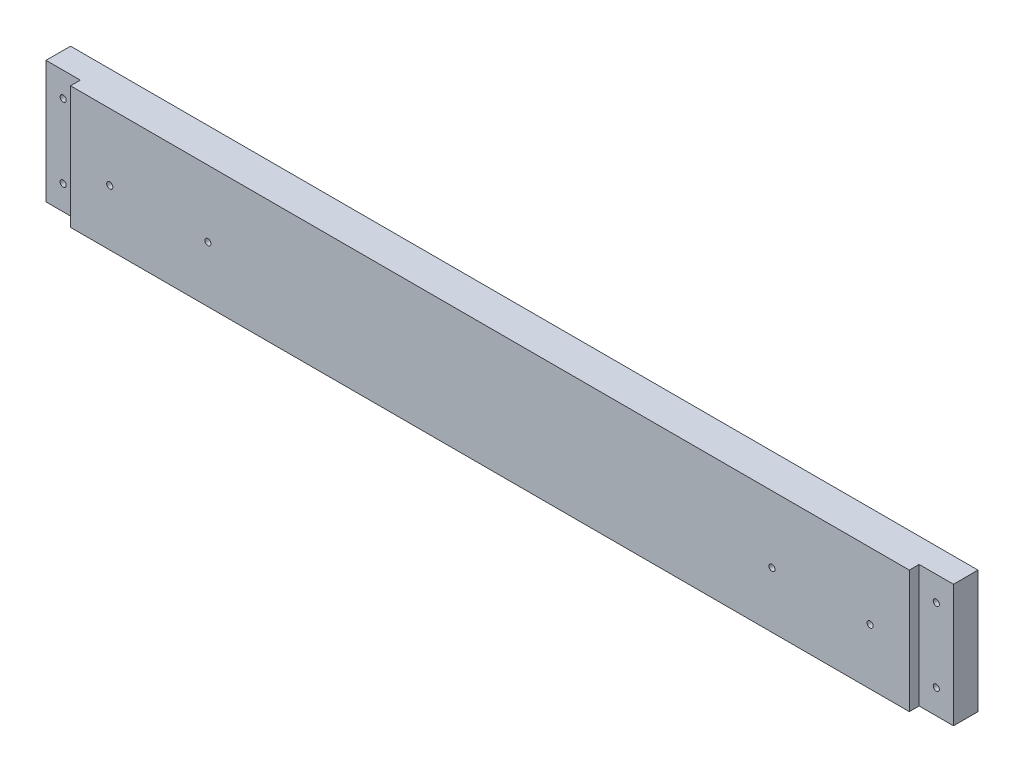
ISO-10303-21;
HEADER;
FILE_DESCRIPTION(('STEP AP214'),'2;1');
FILE_NAME('part.step','',(''),(''),'','','');
FILE_SCHEMA(('AUTOMOTIVE_DESIGN { 1 0 10303 214 1 1 1 1 }'));
ENDSEC;
DATA;
#1=APPLICATION_CONTEXT('core data for automotive mechanical design processes');
#2=APPLICATION_PROTOCOL_DEFINITION('international standard','automotive_design',2000,#1);
#3=PRODUCT_CONTEXT('',#1,'mechanical');
#4=PRODUCT('Part','Part','',(#3));
#5=PRODUCT_RELATED_PRODUCT_CATEGORY('part','',(#4));
#6=PRODUCT_DEFINITION_FORMATION('','',#4);
#7=PRODUCT_DEFINITION_CONTEXT('part definition',#1,'design');
#8=PRODUCT_DEFINITION('design','',#6,#7);
#9=PRODUCT_DEFINITION_SHAPE('','',#8);
#10=(LENGTH_UNIT() NAMED_UNIT(*) SI_UNIT(.MILLI.,.METRE.));
#11=(NAMED_UNIT(*) PLANE_ANGLE_UNIT() SI_UNIT($,.RADIAN.));
#12=(NAMED_UNIT(*) SI_UNIT($,.STERADIAN.) SOLID_ANGLE_UNIT());
#13=UNCERTAINTY_MEASURE_WITH_UNIT(LENGTH_MEASURE(1.E-05),#10,'distance_accuracy_value','');
#14=(GEOMETRIC_REPRESENTATION_CONTEXT(3) GLOBAL_UNCERTAINTY_ASSIGNED_CONTEXT((#13)) GLOBAL_UNIT_ASSIGNED_CONTEXT((#10,
#11,#12)) REPRESENTATION_CONTEXT('',''));
#15=CARTESIAN_POINT('',(0.,0.,0.));
#16=DIRECTION('',(0.,0.,1.));
#17=DIRECTION('',(1.,0.,0.));
#18=AXIS2_PLACEMENT_3D('',#15,#16,#17);
#19=CARTESIAN_POINT('',(10838.3916666658,-5719.7625,-17.78));
#20=DIRECTION('',(0.,-1.,0.));
#21=DIRECTION('',(0.,0.,-1.));
#22=AXIS2_PLACEMENT_3D('',#19,#20,#21);
#23=PLANE('',#22);
#24=DIRECTION('',(0.,0.,1.));
#25=VECTOR('',#24,1.);
#26=CARTESIAN_POINT('',(10856.1716666658,-5719.7625,-5.08));
#27=LINE('',#26,#25);
#28=CARTESIAN_POINT('',(10856.1716666658,-5719.7625,-5.08));
#29=VERTEX_POINT('',#28);
#30=CARTESIAN_POINT('',(10856.1716666658,-5719.7625,0.));
#31=VERTEX_POINT('',#30);
#32=EDGE_CURVE('E47',#29,#31,#27,.T.);
#33=ORIENTED_EDGE('',*,*,#32,.F.);
#34=DIRECTION('',(1.,0.,0.));
#35=VECTOR('',#34,1.);
#36=CARTESIAN_POINT('',(10856.1716666658,-5719.7625,-5.08));
#37=LINE('',#36,#35);
#38=CARTESIAN_POINT('',(10838.3916666658,-5719.7625,-5.08));
#39=VERTEX_POINT('',#38);
#40=EDGE_CURVE('E114',#39,#29,#37,.T.);
#41=ORIENTED_EDGE('',*,*,#40,.F.);
#42=DIRECTION('',(0.,0.,1.));
#43=VECTOR('',#42,1.);
#44=CARTESIAN_POINT('',(10838.3916666658,-5719.7625,-17.78));
#45=LINE('',#44,#43);
#46=CARTESIAN_POINT('',(10838.3916666658,-5719.7625,-17.78));
#47=VERTEX_POINT('',#46);
#48=EDGE_CURVE('E11',#47,#39,#45,.T.);
#49=ORIENTED_EDGE('',*,*,#48,.F.);
#50=DIRECTION('',(1.,0.,0.));
#51=VECTOR('',#50,1.);
#52=CARTESIAN_POINT('',(10838.3916666658,-5719.7625,-17.78));
#53=LINE('',#52,#51);
#54=CARTESIAN_POINT('',(11308.2916666658,-5719.7625,-17.78));
#55=VERTEX_POINT('',#54);
#56=EDGE_CURVE('E178',#47,#55,#53,.T.);
#57=ORIENTED_EDGE('',*,*,#56,.T.);
#58=DIRECTION('',(0.,0.,1.));
#59=VECTOR('',#58,1.);
#60=CARTESIAN_POINT('',(11308.2916666658,-5719.7625,-17.78));
#61=LINE('',#60,#59);
#62=CARTESIAN_POINT('',(11308.2916666658,-5719.7625,-5.08));
#63=VERTEX_POINT('',#62);
#64=EDGE_CURVE('E123',#55,#63,#61,.T.);
#65=ORIENTED_EDGE('',*,*,#64,.T.);
#66=DIRECTION('',(1.,0.,0.));
#67=VECTOR('',#66,1.);
#68=CARTESIAN_POINT('',(11308.2916666658,-5719.7625,-5.08));
#69=LINE('',#68,#67);
#70=CARTESIAN_POINT('',(11290.5116666658,-5719.7625,-5.08));
#71=VERTEX_POINT('',#70);
#72=EDGE_CURVE('E165',#71,#63,#69,.T.);
#73=ORIENTED_EDGE('',*,*,#72,.F.);
#74=DIRECTION('',(0.,0.,1.));
#75=VECTOR('',#74,1.);
#76=CARTESIAN_POINT('',(11290.5116666658,-5719.7625,-5.08));
#77=LINE('',#76,#75);
#78=CARTESIAN_POINT('',(11290.5116666658,-5719.7625,0.));
#79=VERTEX_POINT('',#78);
#80=EDGE_CURVE('E172',#71,#79,#77,.T.);
#81=ORIENTED_EDGE('',*,*,#80,.T.);
#82=DIRECTION('',(1.,0.,0.));
#83=VECTOR('',#82,1.);
#84=CARTESIAN_POINT('',(10838.3916666658,-5719.7625,0.));
#85=LINE('',#84,#83);
#86=EDGE_CURVE('E175',#31,#79,#85,.T.);
#87=ORIENTED_EDGE('',*,*,#86,.F.);
#88=EDGE_LOOP('',(#33,#41,#49,#57,#65,#73,#81,#87));
#89=FACE_BOUND('',#88,.T.);
#90=ADVANCED_FACE('F31',(#89),#23,.T.);
#91=CARTESIAN_POINT('',(10838.3916666658,-5656.2625,-17.78));
#92=DIRECTION('',(-1.,0.,0.));
#93=DIRECTION('',(0.,0.,1.));
#94=AXIS2_PLACEMENT_3D('',#91,#92,#93);
#95=PLANE('',#94);
#96=DIRECTION('',(0.,-1.,0.));
#97=VECTOR('',#96,1.);
#98=CARTESIAN_POINT('',(10838.3916666658,-5719.7625,-5.08));
#99=LINE('',#98,#97);
#100=CARTESIAN_POINT('',(10838.3916666658,-5656.2625,-5.08));
#101=VERTEX_POINT('',#100);
#102=EDGE_CURVE('E102',#101,#39,#99,.T.);
#103=ORIENTED_EDGE('',*,*,#102,.F.);
#104=DIRECTION('',(0.,0.,1.));
#105=VECTOR('',#104,1.);
#106=CARTESIAN_POINT('',(10838.3916666658,-5656.2625,-17.78));
#107=LINE('',#106,#105);
#108=CARTESIAN_POINT('',(10838.3916666658,-5656.2625,-17.78));
#109=VERTEX_POINT('',#108);
#110=EDGE_CURVE('E39',#109,#101,#107,.T.);
#111=ORIENTED_EDGE('',*,*,#110,.F.);
#112=DIRECTION('',(0.,-1.,0.));
#113=VECTOR('',#112,1.);
#114=CARTESIAN_POINT('',(10838.3916666658,-5656.2625,-17.78));
#115=LINE('',#114,#113);
#116=EDGE_CURVE('E129',#109,#47,#115,.T.);
#117=ORIENTED_EDGE('',*,*,#116,.T.);
#118=ORIENTED_EDGE('',*,*,#48,.T.);
#119=EDGE_LOOP('',(#103,#111,#117,#118));
#120=FACE_BOUND('',#119,.T.);
#121=ADVANCED_FACE('F111',(#120),#95,.T.);
#122=CARTESIAN_POINT('',(11308.2916666658,-5656.2625,-17.78));
#123=DIRECTION('',(0.,1.,0.));
#124=DIRECTION('',(0.,0.,1.));
#125=AXIS2_PLACEMENT_3D('',#122,#123,#124);
#126=PLANE('',#125);
#127=DIRECTION('',(0.,0.,1.));
#128=VECTOR('',#127,1.);
#129=CARTESIAN_POINT('',(10856.1716666658,-5656.2625,-5.08));
#130=LINE('',#129,#128);
#131=CARTESIAN_POINT('',(10856.1716666658,-5656.2625,-5.08));
#132=VERTEX_POINT('',#131);
#133=CARTESIAN_POINT('',(10856.1716666658,-5656.2625,0.));
#134=VERTEX_POINT('',#133);
#135=EDGE_CURVE('E158',#132,#134,#130,.T.);
#136=ORIENTED_EDGE('',*,*,#135,.T.);
#137=DIRECTION('',(-1.,0.,0.));
#138=VECTOR('',#137,1.);
#139=CARTESIAN_POINT('',(11308.2916666658,-5656.2625,0.));
#140=LINE('',#139,#138);
#141=CARTESIAN_POINT('',(11290.5116666658,-5656.2625,0.));
#142=VERTEX_POINT('',#141);
#143=EDGE_CURVE('E182',#142,#134,#140,.T.);
#144=ORIENTED_EDGE('',*,*,#143,.F.);
#145=DIRECTION('',(0.,0.,1.));
#146=VECTOR('',#145,1.);
#147=CARTESIAN_POINT('',(11290.5116666658,-5656.2625,-5.08));
#148=LINE('',#147,#146);
#149=CARTESIAN_POINT('',(11290.5116666658,-5656.2625,-5.08));
#150=VERTEX_POINT('',#149);
#151=EDGE_CURVE('E55',#150,#142,#148,.T.);
#152=ORIENTED_EDGE('',*,*,#151,.F.);
#153=DIRECTION('',(-1.,0.,0.));
#154=VECTOR('',#153,1.);
#155=CARTESIAN_POINT('',(11290.5116666658,-5656.2625,-5.08));
#156=LINE('',#155,#154);
#157=CARTESIAN_POINT('',(11308.2916666658,-5656.2625,-5.08));
#158=VERTEX_POINT('',#157);
#159=EDGE_CURVE('E169',#158,#150,#156,.T.);
#160=ORIENTED_EDGE('',*,*,#159,.F.);
#161=DIRECTION('',(0.,0.,1.));
#162=VECTOR('',#161,1.);
#163=CARTESIAN_POINT('',(11308.2916666658,-5656.2625,-17.78));
#164=LINE('',#163,#162);
#165=CARTESIAN_POINT('',(11308.2916666658,-5656.2625,-17.78));
#166=VERTEX_POINT('',#165);
#167=EDGE_CURVE('E120',#166,#158,#164,.T.);
#168=ORIENTED_EDGE('',*,*,#167,.F.);
#169=DIRECTION('',(-1.,0.,0.));
#170=VECTOR('',#169,1.);
#171=CARTESIAN_POINT('',(11308.2916666658,-5656.2625,-17.78));
#172=LINE('',#171,#170);
#173=EDGE_CURVE('E118',#166,#109,#172,.T.);
#174=ORIENTED_EDGE('',*,*,#173,.T.);
#175=ORIENTED_EDGE('',*,*,#110,.T.);
#176=DIRECTION('',(-1.,0.,0.));
#177=VECTOR('',#176,1.);
#178=CARTESIAN_POINT('',(10838.3916666658,-5656.2625,-5.08));
#179=LINE('',#178,#177);
#180=EDGE_CURVE('E99',#132,#101,#179,.T.);
#181=ORIENTED_EDGE('',*,*,#180,.F.);
#182=EDGE_LOOP('',(#136,#144,#152,#160,#168,#174,#175,#181));
#183=FACE_BOUND('',#182,.T.);
#184=ADVANCED_FACE('F116',(#183),#126,.T.);
#185=CARTESIAN_POINT('',(11308.2916666658,-5719.7625,-17.78));
#186=DIRECTION('',(1.,0.,0.));
#187=DIRECTION('',(0.,0.,-1.));
#188=AXIS2_PLACEMENT_3D('',#185,#186,#187);
#189=PLANE('',#188);
#190=DIRECTION('',(0.,1.,0.));
#191=VECTOR('',#190,1.);
#192=CARTESIAN_POINT('',(11308.2916666658,-5656.2625,-5.08));
#193=LINE('',#192,#191);
#194=EDGE_CURVE('E167',#63,#158,#193,.T.);
#195=ORIENTED_EDGE('',*,*,#194,.F.);
#196=ORIENTED_EDGE('',*,*,#64,.F.);
#197=DIRECTION('',(0.,1.,0.));
#198=VECTOR('',#197,1.);
#199=CARTESIAN_POINT('',(11308.2916666658,-5719.7625,-17.78));
#200=LINE('',#199,#198);
#201=EDGE_CURVE('E181',#55,#166,#200,.T.);
#202=ORIENTED_EDGE('',*,*,#201,.T.);
#203=ORIENTED_EDGE('',*,*,#167,.T.);
#204=EDGE_LOOP('',(#195,#196,#202,#203));
#205=FACE_BOUND('',#204,.T.);
#206=ADVANCED_FACE('F203',(#205),#189,.T.);
#207=CARTESIAN_POINT('',(11308.2916666658,-5719.7625,-17.78));
#208=DIRECTION('',(0.,0.,1.));
#209=DIRECTION('',(1.,0.,0.));
#210=AXIS2_PLACEMENT_3D('',#207,#208,#209);
#211=PLANE('',#210);
#212=CARTESIAN_POINT('',(11270.1916666658,-5690.78745,-17.78));
#213=DIRECTION('',(0.,0.,-1.));
#214=DIRECTION('',(-1.,0.,0.));
#215=AXIS2_PLACEMENT_3D('',#212,#213,#214);
#216=CIRCLE('',#215,1.58749999999868);
#217=CARTESIAN_POINT('',(11268.6041666658,-5690.78745,-17.78));
#218=VERTEX_POINT('',#217);
#219=EDGE_CURVE('E361',#218,#218,#216,.T.);
#220=ORIENTED_EDGE('',*,*,#219,.F.);
#221=EDGE_LOOP('',(#220));
#222=FACE_BOUND('',#221,.T.);
#223=CARTESIAN_POINT('',(11219.3916666658,-5690.78745,-17.78));
#224=DIRECTION('',(0.,0.,-1.));
#225=DIRECTION('',(-1.,0.,0.));
#226=AXIS2_PLACEMENT_3D('',#223,#224,#225);
#227=CIRCLE('',#226,1.58749999999868);
#228=CARTESIAN_POINT('',(11217.8041666658,-5690.78745,-17.78));
#229=VERTEX_POINT('',#228);
#230=EDGE_CURVE('E365',#229,#229,#227,.T.);
#231=ORIENTED_EDGE('',*,*,#230,.F.);
#232=EDGE_LOOP('',(#231));
#233=FACE_BOUND('',#232,.T.);
#234=CARTESIAN_POINT('',(10927.2916666658,-5690.78745,-17.78));
#235=DIRECTION('',(0.,0.,-1.));
#236=DIRECTION('',(-1.,0.,0.));
#237=AXIS2_PLACEMENT_3D('',#234,#235,#236);
#238=CIRCLE('',#237,1.58749999999868);
#239=CARTESIAN_POINT('',(10925.7041666658,-5690.78745,-17.78));
#240=VERTEX_POINT('',#239);
#241=EDGE_CURVE('E374',#240,#240,#238,.T.);
#242=ORIENTED_EDGE('',*,*,#241,.F.);
#243=EDGE_LOOP('',(#242));
#244=FACE_BOUND('',#243,.T.);
#245=CARTESIAN_POINT('',(10876.4916666658,-5690.78745,-17.78));
#246=DIRECTION('',(0.,0.,-1.));
#247=DIRECTION('',(-1.,0.,0.));
#248=AXIS2_PLACEMENT_3D('',#245,#246,#247);
#249=CIRCLE('',#248,1.58749999999868);
#250=CARTESIAN_POINT('',(10874.9041666658,-5690.78745,-17.78));
#251=VERTEX_POINT('',#250);
#252=EDGE_CURVE('E380',#251,#251,#249,.T.);
#253=ORIENTED_EDGE('',*,*,#252,.F.);
#254=EDGE_LOOP('',(#253));
#255=FACE_BOUND('',#254,.T.);
#256=CARTESIAN_POINT('',(11299.4016666658,-5668.9625,-17.78));
#257=DIRECTION('',(0.,0.,1.));
#258=DIRECTION('',(1.,0.,0.));
#259=AXIS2_PLACEMENT_3D('',#256,#257,#258);
#260=CIRCLE('',#259,1.58750000000038);
#261=CARTESIAN_POINT('',(11300.9891666658,-5668.9625,-17.78));
#262=VERTEX_POINT('',#261);
#263=EDGE_CURVE('E149',#262,#262,#260,.F.);
#264=ORIENTED_EDGE('',*,*,#263,.F.);
#265=EDGE_LOOP('',(#264));
#266=FACE_BOUND('',#265,.T.);
#267=CARTESIAN_POINT('',(11299.4016666658,-5707.0625,-17.78));
#268=DIRECTION('',(0.,0.,1.));
#269=DIRECTION('',(1.,0.,0.));
#270=AXIS2_PLACEMENT_3D('',#267,#268,#269);
#271=CIRCLE('',#270,1.58750000000038);
#272=CARTESIAN_POINT('',(11300.9891666658,-5707.0625,-17.78));
#273=VERTEX_POINT('',#272);
#274=EDGE_CURVE('E139',#273,#273,#271,.F.);
#275=ORIENTED_EDGE('',*,*,#274,.F.);
#276=EDGE_LOOP('',(#275));
#277=FACE_BOUND('',#276,.T.);
#278=CARTESIAN_POINT('',(10847.2816666658,-5707.0625,-17.78));
#279=DIRECTION('',(0.,0.,1.));
#280=DIRECTION('',(1.,0.,0.));
#281=AXIS2_PLACEMENT_3D('',#278,#279,#280);
#282=CIRCLE('',#281,1.58749999999868);
#283=CARTESIAN_POINT('',(10848.8691666658,-5707.0625,-17.78));
#284=VERTEX_POINT('',#283);
#285=EDGE_CURVE('E136',#284,#284,#282,.F.);
#286=ORIENTED_EDGE('',*,*,#285,.F.);
#287=EDGE_LOOP('',(#286));
#288=FACE_BOUND('',#287,.T.);
#289=CARTESIAN_POINT('',(10847.2816666658,-5668.9625,-17.78));
#290=DIRECTION('',(0.,0.,1.));
#291=DIRECTION('',(1.,0.,0.));
#292=AXIS2_PLACEMENT_3D('',#289,#290,#291);
#293=CIRCLE('',#292,1.58750000000038);
#294=CARTESIAN_POINT('',(10848.8691666658,-5668.9625,-17.78));
#295=VERTEX_POINT('',#294);
#296=EDGE_CURVE('E133',#295,#295,#293,.F.);
#297=ORIENTED_EDGE('',*,*,#296,.F.);
#298=EDGE_LOOP('',(#297));
#299=FACE_BOUND('',#298,.T.);
#300=ORIENTED_EDGE('',*,*,#56,.F.);
#301=ORIENTED_EDGE('',*,*,#116,.F.);
#302=ORIENTED_EDGE('',*,*,#173,.F.);
#303=ORIENTED_EDGE('',*,*,#201,.F.);
#304=EDGE_LOOP('',(#300,#301,#302,#303));
#305=FACE_BOUND('',#304,.T.);
#306=ADVANCED_FACE('F205',(#222,#233,#244,#255,#266,#277,#288,#299,#305),#211,.F.);
#307=CARTESIAN_POINT('',(11308.2916666658,-5719.7625,0.));
#308=DIRECTION('',(0.,0.,1.));
#309=DIRECTION('',(1.,0.,0.));
#310=AXIS2_PLACEMENT_3D('',#307,#308,#309);
#311=PLANE('',#310);
#312=CARTESIAN_POINT('',(11270.1916666658,-5690.78745,0.));
#313=DIRECTION('',(0.,0.,1.));
#314=DIRECTION('',(1.,0.,0.));
#315=AXIS2_PLACEMENT_3D('',#312,#313,#314);
#316=CIRCLE('',#315,1.58749999999868);
#317=CARTESIAN_POINT('',(11271.7791666658,-5690.78745,0.));
#318=VERTEX_POINT('',#317);
#319=EDGE_CURVE('E364',#318,#318,#316,.F.);
#320=ORIENTED_EDGE('',*,*,#319,.T.);
#321=EDGE_LOOP('',(#320));
#322=FACE_BOUND('',#321,.T.);
#323=CARTESIAN_POINT('',(11219.3916666658,-5690.78745,0.));
#324=DIRECTION('',(0.,0.,1.));
#325=DIRECTION('',(1.,0.,0.));
#326=AXIS2_PLACEMENT_3D('',#323,#324,#325);
#327=CIRCLE('',#326,1.58749999999868);
#328=CARTESIAN_POINT('',(11220.9791666658,-5690.78745,0.));
#329=VERTEX_POINT('',#328);
#330=EDGE_CURVE('E368',#329,#329,#327,.F.);
#331=ORIENTED_EDGE('',*,*,#330,.T.);
#332=EDGE_LOOP('',(#331));
#333=FACE_BOUND('',#332,.T.);
#334=CARTESIAN_POINT('',(10927.2916666658,-5690.78745,0.));
#335=DIRECTION('',(0.,0.,1.));
#336=DIRECTION('',(1.,0.,0.));
#337=AXIS2_PLACEMENT_3D('',#334,#335,#336);
#338=CIRCLE('',#337,1.58749999999868);
#339=CARTESIAN_POINT('',(10928.8791666658,-5690.78745,0.));
#340=VERTEX_POINT('',#339);
#341=EDGE_CURVE('E377',#340,#340,#338,.F.);
#342=ORIENTED_EDGE('',*,*,#341,.T.);
#343=EDGE_LOOP('',(#342));
#344=FACE_BOUND('',#343,.T.);
#345=CARTESIAN_POINT('',(10876.4916666658,-5690.78745,0.));
#346=DIRECTION('',(0.,0.,1.));
#347=DIRECTION('',(1.,0.,0.));
#348=AXIS2_PLACEMENT_3D('',#345,#346,#347);
#349=CIRCLE('',#348,1.58749999999868);
#350=CARTESIAN_POINT('',(10878.0791666658,-5690.78745,0.));
#351=VERTEX_POINT('',#350);
#352=EDGE_CURVE('E382',#351,#351,#349,.F.);
#353=ORIENTED_EDGE('',*,*,#352,.T.);
#354=EDGE_LOOP('',(#353));
#355=FACE_BOUND('',#354,.T.);
#356=DIRECTION('',(0.,1.,0.));
#357=VECTOR('',#356,1.);
#358=CARTESIAN_POINT('',(10856.1716666658,-5656.2625,0.));
#359=LINE('',#358,#357);
#360=EDGE_CURVE('E108',#31,#134,#359,.T.);
#361=ORIENTED_EDGE('',*,*,#360,.F.);
#362=ORIENTED_EDGE('',*,*,#86,.T.);
#363=DIRECTION('',(0.,-1.,0.));
#364=VECTOR('',#363,1.);
#365=CARTESIAN_POINT('',(11290.5116666658,-5719.7625,0.));
#366=LINE('',#365,#364);
#367=EDGE_CURVE('E160',#142,#79,#366,.T.);
#368=ORIENTED_EDGE('',*,*,#367,.F.);
#369=ORIENTED_EDGE('',*,*,#143,.T.);
#370=EDGE_LOOP('',(#361,#362,#368,#369));
#371=FACE_BOUND('',#370,.T.);
#372=ADVANCED_FACE('F190',(#322,#333,#344,#355,#371),#311,.T.);
#373=CARTESIAN_POINT('',(11290.5116666658,-5719.7625,-5.08));
#374=DIRECTION('',(-1.,0.,0.));
#375=DIRECTION('',(0.,0.,1.));
#376=AXIS2_PLACEMENT_3D('',#373,#374,#375);
#377=PLANE('',#376);
#378=ORIENTED_EDGE('',*,*,#367,.T.);
#379=ORIENTED_EDGE('',*,*,#80,.F.);
#380=DIRECTION('',(0.,-1.,0.));
#381=VECTOR('',#380,1.);
#382=CARTESIAN_POINT('',(11290.5116666658,-5719.7625,-5.08));
#383=LINE('',#382,#381);
#384=EDGE_CURVE('E162',#150,#71,#383,.T.);
#385=ORIENTED_EDGE('',*,*,#384,.F.);
#386=ORIENTED_EDGE('',*,*,#151,.T.);
#387=EDGE_LOOP('',(#378,#379,#385,#386));
#388=FACE_BOUND('',#387,.T.);
#389=ADVANCED_FACE('F196',(#388),#377,.F.);
#390=CARTESIAN_POINT('',(11290.5116666658,-5656.2625,-5.08));
#391=DIRECTION('',(0.,0.,-1.));
#392=DIRECTION('',(-1.,0.,0.));
#393=AXIS2_PLACEMENT_3D('',#390,#391,#392);
#394=PLANE('',#393);
#395=CARTESIAN_POINT('',(11299.4016666658,-5668.9625,-5.08));
#396=DIRECTION('',(0.,0.,-1.));
#397=DIRECTION('',(-1.,0.,0.));
#398=AXIS2_PLACEMENT_3D('',#395,#396,#397);
#399=CIRCLE('',#398,1.58750000000038);
#400=CARTESIAN_POINT('',(11300.9891666658,-5668.9625,-5.08));
#401=VERTEX_POINT('',#400);
#402=EDGE_CURVE('E34',#401,#401,#399,.T.);
#403=ORIENTED_EDGE('',*,*,#402,.T.);
#404=EDGE_LOOP('',(#403));
#405=FACE_BOUND('',#404,.T.);
#406=CARTESIAN_POINT('',(11299.4016666658,-5707.0625,-5.08));
#407=DIRECTION('',(0.,0.,-1.));
#408=DIRECTION('',(-1.,0.,0.));
#409=AXIS2_PLACEMENT_3D('',#406,#407,#408);
#410=CIRCLE('',#409,1.58750000000038);
#411=CARTESIAN_POINT('',(11300.9891666658,-5707.0625,-5.08));
#412=VERTEX_POINT('',#411);
#413=EDGE_CURVE('E137',#412,#412,#410,.T.);
#414=ORIENTED_EDGE('',*,*,#413,.T.);
#415=EDGE_LOOP('',(#414));
#416=FACE_BOUND('',#415,.T.);
#417=ORIENTED_EDGE('',*,*,#384,.T.);
#418=ORIENTED_EDGE('',*,*,#72,.T.);
#419=ORIENTED_EDGE('',*,*,#194,.T.);
#420=ORIENTED_EDGE('',*,*,#159,.T.);
#421=EDGE_LOOP('',(#417,#418,#419,#420));
#422=FACE_BOUND('',#421,.T.);
#423=ADVANCED_FACE('F198',(#405,#416,#422),#394,.F.);
#424=CARTESIAN_POINT('',(10856.1716666658,-5656.2625,-5.08));
#425=DIRECTION('',(1.,0.,0.));
#426=DIRECTION('',(0.,0.,-1.));
#427=AXIS2_PLACEMENT_3D('',#424,#425,#426);
#428=PLANE('',#427);
#429=ORIENTED_EDGE('',*,*,#360,.T.);
#430=ORIENTED_EDGE('',*,*,#135,.F.);
#431=DIRECTION('',(0.,1.,0.));
#432=VECTOR('',#431,1.);
#433=CARTESIAN_POINT('',(10856.1716666658,-5656.2625,-5.08));
#434=LINE('',#433,#432);
#435=EDGE_CURVE('E104',#29,#132,#434,.T.);
#436=ORIENTED_EDGE('',*,*,#435,.F.);
#437=ORIENTED_EDGE('',*,*,#32,.T.);
#438=EDGE_LOOP('',(#429,#430,#436,#437));
#439=FACE_BOUND('',#438,.T.);
#440=ADVANCED_FACE('F193',(#439),#428,.F.);
#441=CARTESIAN_POINT('',(10856.1716666658,-5656.2625,-5.08));
#442=DIRECTION('',(0.,0.,-1.));
#443=DIRECTION('',(-1.,0.,0.));
#444=AXIS2_PLACEMENT_3D('',#441,#442,#443);
#445=PLANE('',#444);
#446=CARTESIAN_POINT('',(10847.2816666658,-5707.0625,-5.08));
#447=DIRECTION('',(0.,0.,-1.));
#448=DIRECTION('',(-1.,0.,0.));
#449=AXIS2_PLACEMENT_3D('',#446,#447,#448);
#450=CIRCLE('',#449,1.58749999999868);
#451=CARTESIAN_POINT('',(10848.8691666658,-5707.0625,-5.08));
#452=VERTEX_POINT('',#451);
#453=EDGE_CURVE('E134',#452,#452,#450,.T.);
#454=ORIENTED_EDGE('',*,*,#453,.T.);
#455=EDGE_LOOP('',(#454));
#456=FACE_BOUND('',#455,.T.);
#457=CARTESIAN_POINT('',(10847.2816666658,-5668.9625,-5.08));
#458=DIRECTION('',(0.,0.,-1.));
#459=DIRECTION('',(-1.,0.,0.));
#460=AXIS2_PLACEMENT_3D('',#457,#458,#459);
#461=CIRCLE('',#460,1.58750000000038);
#462=CARTESIAN_POINT('',(10848.8691666658,-5668.9625,-5.08));
#463=VERTEX_POINT('',#462);
#464=EDGE_CURVE('E130',#463,#463,#461,.T.);
#465=ORIENTED_EDGE('',*,*,#464,.T.);
#466=EDGE_LOOP('',(#465));
#467=FACE_BOUND('',#466,.T.);
#468=ORIENTED_EDGE('',*,*,#180,.T.);
#469=ORIENTED_EDGE('',*,*,#102,.T.);
#470=ORIENTED_EDGE('',*,*,#40,.T.);
#471=ORIENTED_EDGE('',*,*,#435,.T.);
#472=EDGE_LOOP('',(#468,#469,#470,#471));
#473=FACE_BOUND('',#472,.T.);
#474=ADVANCED_FACE('F101',(#456,#467,#473),#445,.F.);
#475=CARTESIAN_POINT('',(10847.2816666658,-5668.9625,-22.2701280605367));
#476=DIRECTION('',(0.,0.,1.));
#477=DIRECTION('',(1.,0.,0.));
#478=AXIS2_PLACEMENT_3D('',#475,#476,#477);
#479=CYLINDRICAL_SURFACE('',#478,1.58750000000038);
#480=CARTESIAN_POINT('',(10848.8691666658,-5668.9625,-17.78));
#481=CARTESIAN_POINT('',(10848.8691666658,-5668.9625,-17.6477083333333));
#482=CARTESIAN_POINT('',(10848.8691666658,-5668.9625,-17.5154166666667));
#483=CARTESIAN_POINT('',(10848.8691666658,-5668.9625,-17.2508333333333));
#484=CARTESIAN_POINT('',(10848.8691666658,-5668.9625,-17.1185416666667));
#485=CARTESIAN_POINT('',(10848.8691666658,-5668.9625,-16.8539583333333));
#486=CARTESIAN_POINT('',(10848.8691666658,-5668.9625,-16.7216666666667));
#487=CARTESIAN_POINT('',(10848.8691666658,-5668.9625,-16.4570833333333));
#488=CARTESIAN_POINT('',(10848.8691666658,-5668.9625,-16.3247916666667));
#489=CARTESIAN_POINT('',(10848.8691666658,-5668.9625,-16.0602083333333));
#490=CARTESIAN_POINT('',(10848.8691666658,-5668.9625,-15.9279166666667));
#491=CARTESIAN_POINT('',(10848.8691666658,-5668.9625,-15.6633333333333));
#492=CARTESIAN_POINT('',(10848.8691666658,-5668.9625,-15.5310416666667));
#493=CARTESIAN_POINT('',(10848.8691666658,-5668.9625,-15.2664583333333));
#494=CARTESIAN_POINT('',(10848.8691666658,-5668.9625,-15.1341666666667));
#495=CARTESIAN_POINT('',(10848.8691666658,-5668.9625,-14.8695833333333));
#496=CARTESIAN_POINT('',(10848.8691666658,-5668.9625,-14.7372916666667));
#497=CARTESIAN_POINT('',(10848.8691666658,-5668.9625,-14.4727083333333));
#498=CARTESIAN_POINT('',(10848.8691666658,-5668.9625,-14.3404166666667));
#499=CARTESIAN_POINT('',(10848.8691666658,-5668.9625,-14.0758333333333));
#500=CARTESIAN_POINT('',(10848.8691666658,-5668.9625,-13.9435416666667));
#501=CARTESIAN_POINT('',(10848.8691666658,-5668.9625,-13.6789583333333));
#502=CARTESIAN_POINT('',(10848.8691666658,-5668.9625,-13.5466666666667));
#503=CARTESIAN_POINT('',(10848.8691666658,-5668.9625,-13.2820833333333));
#504=CARTESIAN_POINT('',(10848.8691666658,-5668.9625,-13.1497916666667));
#505=CARTESIAN_POINT('',(10848.8691666658,-5668.9625,-12.8852083333333));
#506=CARTESIAN_POINT('',(10848.8691666658,-5668.9625,-12.7529166666667));
#507=CARTESIAN_POINT('',(10848.8691666658,-5668.9625,-12.4883333333333));
#508=CARTESIAN_POINT('',(10848.8691666658,-5668.9625,-12.3560416666667));
#509=CARTESIAN_POINT('',(10848.8691666658,-5668.9625,-12.0914583333333));
#510=CARTESIAN_POINT('',(10848.8691666658,-5668.9625,-11.9591666666667));
#511=CARTESIAN_POINT('',(10848.8691666658,-5668.9625,-11.6945833333333));
#512=CARTESIAN_POINT('',(10848.8691666658,-5668.9625,-11.5622916666667));
#513=CARTESIAN_POINT('',(10848.8691666658,-5668.9625,-11.2977083333333));
#514=CARTESIAN_POINT('',(10848.8691666658,-5668.9625,-11.1654166666667));
#515=CARTESIAN_POINT('',(10848.8691666658,-5668.9625,-10.9008333333333));
#516=CARTESIAN_POINT('',(10848.8691666658,-5668.9625,-10.7685416666667));
#517=CARTESIAN_POINT('',(10848.8691666658,-5668.9625,-10.5039583333333));
#518=CARTESIAN_POINT('',(10848.8691666658,-5668.9625,-10.3716666666667));
#519=CARTESIAN_POINT('',(10848.8691666658,-5668.9625,-10.1070833333333));
#520=CARTESIAN_POINT('',(10848.8691666658,-5668.9625,-9.97479166666666));
#521=CARTESIAN_POINT('',(10848.8691666658,-5668.9625,-9.71020833333333));
#522=CARTESIAN_POINT('',(10848.8691666658,-5668.9625,-9.57791666666666));
#523=CARTESIAN_POINT('',(10848.8691666658,-5668.9625,-9.31333333333333));
#524=CARTESIAN_POINT('',(10848.8691666658,-5668.9625,-9.18104166666666));
#525=CARTESIAN_POINT('',(10848.8691666658,-5668.9625,-8.91645833333333));
#526=CARTESIAN_POINT('',(10848.8691666658,-5668.9625,-8.78416666666666));
#527=CARTESIAN_POINT('',(10848.8691666658,-5668.9625,-8.51958333333333));
#528=CARTESIAN_POINT('',(10848.8691666658,-5668.9625,-8.38729166666666));
#529=CARTESIAN_POINT('',(10848.8691666658,-5668.9625,-8.12270833333333));
#530=CARTESIAN_POINT('',(10848.8691666658,-5668.9625,-7.99041666666666));
#531=CARTESIAN_POINT('',(10848.8691666658,-5668.9625,-7.72583333333333));
#532=CARTESIAN_POINT('',(10848.8691666658,-5668.9625,-7.59354166666666));
#533=CARTESIAN_POINT('',(10848.8691666658,-5668.9625,-7.32895833333333));
#534=CARTESIAN_POINT('',(10848.8691666658,-5668.9625,-7.19666666666666));
#535=CARTESIAN_POINT('',(10848.8691666658,-5668.9625,-6.93208333333333));
#536=CARTESIAN_POINT('',(10848.8691666658,-5668.9625,-6.79979166666666));
#537=CARTESIAN_POINT('',(10848.8691666658,-5668.9625,-6.53520833333333));
#538=CARTESIAN_POINT('',(10848.8691666658,-5668.9625,-6.40291666666666));
#539=CARTESIAN_POINT('',(10848.8691666658,-5668.9625,-6.13833333333333));
#540=CARTESIAN_POINT('',(10848.8691666658,-5668.9625,-6.00604166666667));
#541=CARTESIAN_POINT('',(10848.8691666658,-5668.9625,-5.74145833333333));
#542=CARTESIAN_POINT('',(10848.8691666658,-5668.9625,-5.60916666666666));
#543=CARTESIAN_POINT('',(10848.8691666658,-5668.9625,-5.34458333333333));
#544=CARTESIAN_POINT('',(10848.8691666658,-5668.9625,-5.21229166666666));
#545=CARTESIAN_POINT('',(10848.8691666658,-5668.9625,-5.08));
#546=B_SPLINE_CURVE_WITH_KNOTS('',3,(#480,#481,#482,#483,#484,#485,#486,#487,#488,#489,#490,
#491,#492,#493,#494,#495,#496,#497,#498,#499,#500,#501,#502,#503,#504,#505,#506,#507,#508,#509,
#510,#511,#512,#513,#514,#515,#516,#517,#518,#519,#520,#521,#522,#523,#524,#525,#526,#527,#528,
#529,#530,#531,#532,#533,#534,#535,#536,#537,#538,#539,#540,#541,#542,#543,#544,#545),
.UNSPECIFIED.,.F.,.F.,(4,2,2,2,2,2,2,2,2,2,2,2,2,2,2,2,2,2,2,2,2,2,2,2,2,2,2,2,2,2,2,2,4),(0.,
0.396875000000001,0.793749999999999,1.190625,1.5875,1.984375,2.38125,2.778125,3.175,3.571875,
3.96875,4.365625,4.7625,5.159375,5.55625,5.953125,6.35,6.746875,7.14375,7.540625,7.9375,
8.334375,8.73125,9.128125,9.525,9.921875,10.31875,10.715625,11.1125,11.509375,11.90625,
12.303125,12.7),.UNSPECIFIED.);
#547=EDGE_CURVE('BSEAM268',#295,#463,#546,.T.);
#548=ORIENTED_EDGE('',*,*,#296,.T.);
#549=ORIENTED_EDGE('',*,*,#464,.F.);
#550=ORIENTED_EDGE('',*,*,#547,.T.);
#551=ORIENTED_EDGE('',*,*,#547,.F.);
#552=EDGE_LOOP('',(#548,#550,#549,#551));
#553=FACE_BOUND('',#552,.T.);
#554=ADVANCED_FACE('F268',(#553),#479,.F.);
#555=CARTESIAN_POINT('',(10847.2816666658,-5707.0625,-22.2701280605367));
#556=DIRECTION('',(0.,0.,1.));
#557=DIRECTION('',(1.,0.,0.));
#558=AXIS2_PLACEMENT_3D('',#555,#556,#557);
#559=CYLINDRICAL_SURFACE('',#558,1.58749999999868);
#560=CARTESIAN_POINT('',(10848.8691666658,-5707.0625,-17.78));
#561=CARTESIAN_POINT('',(10848.8691666658,-5707.0625,-17.6477083333333));
#562=CARTESIAN_POINT('',(10848.8691666658,-5707.0625,-17.5154166666667));
#563=CARTESIAN_POINT('',(10848.8691666658,-5707.0625,-17.2508333333333));
#564=CARTESIAN_POINT('',(10848.8691666658,-5707.0625,-17.1185416666667));
#565=CARTESIAN_POINT('',(10848.8691666658,-5707.0625,-16.8539583333333));
#566=CARTESIAN_POINT('',(10848.8691666658,-5707.0625,-16.7216666666667));
#567=CARTESIAN_POINT('',(10848.8691666658,-5707.0625,-16.4570833333333));
#568=CARTESIAN_POINT('',(10848.8691666658,-5707.0625,-16.3247916666667));
#569=CARTESIAN_POINT('',(10848.8691666658,-5707.0625,-16.0602083333333));
#570=CARTESIAN_POINT('',(10848.8691666658,-5707.0625,-15.9279166666667));
#571=CARTESIAN_POINT('',(10848.8691666658,-5707.0625,-15.6633333333333));
#572=CARTESIAN_POINT('',(10848.8691666658,-5707.0625,-15.5310416666667));
#573=CARTESIAN_POINT('',(10848.8691666658,-5707.0625,-15.2664583333333));
#574=CARTESIAN_POINT('',(10848.8691666658,-5707.0625,-15.1341666666667));
#575=CARTESIAN_POINT('',(10848.8691666658,-5707.0625,-14.8695833333333));
#576=CARTESIAN_POINT('',(10848.8691666658,-5707.0625,-14.7372916666667));
#577=CARTESIAN_POINT('',(10848.8691666658,-5707.0625,-14.4727083333333));
#578=CARTESIAN_POINT('',(10848.8691666658,-5707.0625,-14.3404166666667));
#579=CARTESIAN_POINT('',(10848.8691666658,-5707.0625,-14.0758333333333));
#580=CARTESIAN_POINT('',(10848.8691666658,-5707.0625,-13.9435416666667));
#581=CARTESIAN_POINT('',(10848.8691666658,-5707.0625,-13.6789583333333));
#582=CARTESIAN_POINT('',(10848.8691666658,-5707.0625,-13.5466666666667));
#583=CARTESIAN_POINT('',(10848.8691666658,-5707.0625,-13.2820833333333));
#584=CARTESIAN_POINT('',(10848.8691666658,-5707.0625,-13.1497916666667));
#585=CARTESIAN_POINT('',(10848.8691666658,-5707.0625,-12.8852083333333));
#586=CARTESIAN_POINT('',(10848.8691666658,-5707.0625,-12.7529166666667));
#587=CARTESIAN_POINT('',(10848.8691666658,-5707.0625,-12.4883333333333));
#588=CARTESIAN_POINT('',(10848.8691666658,-5707.0625,-12.3560416666667));
#589=CARTESIAN_POINT('',(10848.8691666658,-5707.0625,-12.0914583333333));
#590=CARTESIAN_POINT('',(10848.8691666658,-5707.0625,-11.9591666666667));
#591=CARTESIAN_POINT('',(10848.8691666658,-5707.0625,-11.6945833333333));
#592=CARTESIAN_POINT('',(10848.8691666658,-5707.0625,-11.5622916666667));
#593=CARTESIAN_POINT('',(10848.8691666658,-5707.0625,-11.2977083333333));
#594=CARTESIAN_POINT('',(10848.8691666658,-5707.0625,-11.1654166666667));
#595=CARTESIAN_POINT('',(10848.8691666658,-5707.0625,-10.9008333333333));
#596=CARTESIAN_POINT('',(10848.8691666658,-5707.0625,-10.7685416666667));
#597=CARTESIAN_POINT('',(10848.8691666658,-5707.0625,-10.5039583333333));
#598=CARTESIAN_POINT('',(10848.8691666658,-5707.0625,-10.3716666666667));
#599=CARTESIAN_POINT('',(10848.8691666658,-5707.0625,-10.1070833333333));
#600=CARTESIAN_POINT('',(10848.8691666658,-5707.0625,-9.97479166666666));
#601=CARTESIAN_POINT('',(10848.8691666658,-5707.0625,-9.71020833333333));
#602=CARTESIAN_POINT('',(10848.8691666658,-5707.0625,-9.57791666666666));
#603=CARTESIAN_POINT('',(10848.8691666658,-5707.0625,-9.31333333333333));
#604=CARTESIAN_POINT('',(10848.8691666658,-5707.0625,-9.18104166666666));
#605=CARTESIAN_POINT('',(10848.8691666658,-5707.0625,-8.91645833333333));
#606=CARTESIAN_POINT('',(10848.8691666658,-5707.0625,-8.78416666666666));
#607=CARTESIAN_POINT('',(10848.8691666658,-5707.0625,-8.51958333333333));
#608=CARTESIAN_POINT('',(10848.8691666658,-5707.0625,-8.38729166666666));
#609=CARTESIAN_POINT('',(10848.8691666658,-5707.0625,-8.12270833333333));
#610=CARTESIAN_POINT('',(10848.8691666658,-5707.0625,-7.99041666666666));
#611=CARTESIAN_POINT('',(10848.8691666658,-5707.0625,-7.72583333333333));
#612=CARTESIAN_POINT('',(10848.8691666658,-5707.0625,-7.59354166666666));
#613=CARTESIAN_POINT('',(10848.8691666658,-5707.0625,-7.32895833333333));
#614=CARTESIAN_POINT('',(10848.8691666658,-5707.0625,-7.19666666666666));
#615=CARTESIAN_POINT('',(10848.8691666658,-5707.0625,-6.93208333333333));
#616=CARTESIAN_POINT('',(10848.8691666658,-5707.0625,-6.79979166666666));
#617=CARTESIAN_POINT('',(10848.8691666658,-5707.0625,-6.53520833333333));
#618=CARTESIAN_POINT('',(10848.8691666658,-5707.0625,-6.40291666666666));
#619=CARTESIAN_POINT('',(10848.8691666658,-5707.0625,-6.13833333333333));
#620=CARTESIAN_POINT('',(10848.8691666658,-5707.0625,-6.00604166666667));
#621=CARTESIAN_POINT('',(10848.8691666658,-5707.0625,-5.74145833333333));
#622=CARTESIAN_POINT('',(10848.8691666658,-5707.0625,-5.60916666666666));
#623=CARTESIAN_POINT('',(10848.8691666658,-5707.0625,-5.34458333333333));
#624=CARTESIAN_POINT('',(10848.8691666658,-5707.0625,-5.21229166666666));
#625=CARTESIAN_POINT('',(10848.8691666658,-5707.0625,-5.08));
#626=B_SPLINE_CURVE_WITH_KNOTS('',3,(#560,#561,#562,#563,#564,#565,#566,#567,#568,#569,#570,
#571,#572,#573,#574,#575,#576,#577,#578,#579,#580,#581,#582,#583,#584,#585,#586,#587,#588,#589,
#590,#591,#592,#593,#594,#595,#596,#597,#598,#599,#600,#601,#602,#603,#604,#605,#606,#607,#608,
#609,#610,#611,#612,#613,#614,#615,#616,#617,#618,#619,#620,#621,#622,#623,#624,#625),
.UNSPECIFIED.,.F.,.F.,(4,2,2,2,2,2,2,2,2,2,2,2,2,2,2,2,2,2,2,2,2,2,2,2,2,2,2,2,2,2,2,2,4),(0.,
0.396875000000001,0.793749999999999,1.190625,1.5875,1.984375,2.38125,2.778125,3.175,3.571875,
3.96875,4.365625,4.7625,5.159375,5.55625,5.953125,6.35,6.746875,7.14375,7.540625,7.9375,
8.334375,8.73125,9.128125,9.525,9.921875,10.31875,10.715625,11.1125,11.509375,11.90625,
12.303125,12.7),.UNSPECIFIED.);
#627=EDGE_CURVE('BSEAM278',#284,#452,#626,.T.);
#628=ORIENTED_EDGE('',*,*,#285,.T.);
#629=ORIENTED_EDGE('',*,*,#453,.F.);
#630=ORIENTED_EDGE('',*,*,#627,.T.);
#631=ORIENTED_EDGE('',*,*,#627,.F.);
#632=EDGE_LOOP('',(#628,#630,#629,#631));
#633=FACE_BOUND('',#632,.T.);
#634=ADVANCED_FACE('F278',(#633),#559,.F.);
#635=CARTESIAN_POINT('',(11299.4016666658,-5707.0625,-22.2701280605367));
#636=DIRECTION('',(0.,0.,1.));
#637=DIRECTION('',(1.,0.,0.));
#638=AXIS2_PLACEMENT_3D('',#635,#636,#637);
#639=CYLINDRICAL_SURFACE('',#638,1.58750000000038);
#640=CARTESIAN_POINT('',(11300.9891666658,-5707.0625,-17.78));
#641=CARTESIAN_POINT('',(11300.9891666658,-5707.0625,-17.6477083333333));
#642=CARTESIAN_POINT('',(11300.9891666658,-5707.0625,-17.5154166666667));
#643=CARTESIAN_POINT('',(11300.9891666658,-5707.0625,-17.2508333333333));
#644=CARTESIAN_POINT('',(11300.9891666658,-5707.0625,-17.1185416666667));
#645=CARTESIAN_POINT('',(11300.9891666658,-5707.0625,-16.8539583333333));
#646=CARTESIAN_POINT('',(11300.9891666658,-5707.0625,-16.7216666666667));
#647=CARTESIAN_POINT('',(11300.9891666658,-5707.0625,-16.4570833333333));
#648=CARTESIAN_POINT('',(11300.9891666658,-5707.0625,-16.3247916666667));
#649=CARTESIAN_POINT('',(11300.9891666658,-5707.0625,-16.0602083333333));
#650=CARTESIAN_POINT('',(11300.9891666658,-5707.0625,-15.9279166666667));
#651=CARTESIAN_POINT('',(11300.9891666658,-5707.0625,-15.6633333333333));
#652=CARTESIAN_POINT('',(11300.9891666658,-5707.0625,-15.5310416666667));
#653=CARTESIAN_POINT('',(11300.9891666658,-5707.0625,-15.2664583333333));
#654=CARTESIAN_POINT('',(11300.9891666658,-5707.0625,-15.1341666666667));
#655=CARTESIAN_POINT('',(11300.9891666658,-5707.0625,-14.8695833333333));
#656=CARTESIAN_POINT('',(11300.9891666658,-5707.0625,-14.7372916666667));
#657=CARTESIAN_POINT('',(11300.9891666658,-5707.0625,-14.4727083333333));
#658=CARTESIAN_POINT('',(11300.9891666658,-5707.0625,-14.3404166666667));
#659=CARTESIAN_POINT('',(11300.9891666658,-5707.0625,-14.0758333333333));
#660=CARTESIAN_POINT('',(11300.9891666658,-5707.0625,-13.9435416666667));
#661=CARTESIAN_POINT('',(11300.9891666658,-5707.0625,-13.6789583333333));
#662=CARTESIAN_POINT('',(11300.9891666658,-5707.0625,-13.5466666666667));
#663=CARTESIAN_POINT('',(11300.9891666658,-5707.0625,-13.2820833333333));
#664=CARTESIAN_POINT('',(11300.9891666658,-5707.0625,-13.1497916666667));
#665=CARTESIAN_POINT('',(11300.9891666658,-5707.0625,-12.8852083333333));
#666=CARTESIAN_POINT('',(11300.9891666658,-5707.0625,-12.7529166666667));
#667=CARTESIAN_POINT('',(11300.9891666658,-5707.0625,-12.4883333333333));
#668=CARTESIAN_POINT('',(11300.9891666658,-5707.0625,-12.3560416666667));
#669=CARTESIAN_POINT('',(11300.9891666658,-5707.0625,-12.0914583333333));
#670=CARTESIAN_POINT('',(11300.9891666658,-5707.0625,-11.9591666666667));
#671=CARTESIAN_POINT('',(11300.9891666658,-5707.0625,-11.6945833333333));
#672=CARTESIAN_POINT('',(11300.9891666658,-5707.0625,-11.5622916666667));
#673=CARTESIAN_POINT('',(11300.9891666658,-5707.0625,-11.2977083333333));
#674=CARTESIAN_POINT('',(11300.9891666658,-5707.0625,-11.1654166666667));
#675=CARTESIAN_POINT('',(11300.9891666658,-5707.0625,-10.9008333333333));
#676=CARTESIAN_POINT('',(11300.9891666658,-5707.0625,-10.7685416666667));
#677=CARTESIAN_POINT('',(11300.9891666658,-5707.0625,-10.5039583333333));
#678=CARTESIAN_POINT('',(11300.9891666658,-5707.0625,-10.3716666666667));
#679=CARTESIAN_POINT('',(11300.9891666658,-5707.0625,-10.1070833333333));
#680=CARTESIAN_POINT('',(11300.9891666658,-5707.0625,-9.97479166666666));
#681=CARTESIAN_POINT('',(11300.9891666658,-5707.0625,-9.71020833333333));
#682=CARTESIAN_POINT('',(11300.9891666658,-5707.0625,-9.57791666666666));
#683=CARTESIAN_POINT('',(11300.9891666658,-5707.0625,-9.31333333333333));
#684=CARTESIAN_POINT('',(11300.9891666658,-5707.0625,-9.18104166666666));
#685=CARTESIAN_POINT('',(11300.9891666658,-5707.0625,-8.91645833333333));
#686=CARTESIAN_POINT('',(11300.9891666658,-5707.0625,-8.78416666666666));
#687=CARTESIAN_POINT('',(11300.9891666658,-5707.0625,-8.51958333333333));
#688=CARTESIAN_POINT('',(11300.9891666658,-5707.0625,-8.38729166666666));
#689=CARTESIAN_POINT('',(11300.9891666658,-5707.0625,-8.12270833333333));
#690=CARTESIAN_POINT('',(11300.9891666658,-5707.0625,-7.99041666666666));
#691=CARTESIAN_POINT('',(11300.9891666658,-5707.0625,-7.72583333333333));
#692=CARTESIAN_POINT('',(11300.9891666658,-5707.0625,-7.59354166666666));
#693=CARTESIAN_POINT('',(11300.9891666658,-5707.0625,-7.32895833333333));
#694=CARTESIAN_POINT('',(11300.9891666658,-5707.0625,-7.19666666666666));
#695=CARTESIAN_POINT('',(11300.9891666658,-5707.0625,-6.93208333333333));
#696=CARTESIAN_POINT('',(11300.9891666658,-5707.0625,-6.79979166666666));
#697=CARTESIAN_POINT('',(11300.9891666658,-5707.0625,-6.53520833333333));
#698=CARTESIAN_POINT('',(11300.9891666658,-5707.0625,-6.40291666666666));
#699=CARTESIAN_POINT('',(11300.9891666658,-5707.0625,-6.13833333333333));
#700=CARTESIAN_POINT('',(11300.9891666658,-5707.0625,-6.00604166666667));
#701=CARTESIAN_POINT('',(11300.9891666658,-5707.0625,-5.74145833333333));
#702=CARTESIAN_POINT('',(11300.9891666658,-5707.0625,-5.60916666666666));
#703=CARTESIAN_POINT('',(11300.9891666658,-5707.0625,-5.34458333333333));
#704=CARTESIAN_POINT('',(11300.9891666658,-5707.0625,-5.21229166666666));
#705=CARTESIAN_POINT('',(11300.9891666658,-5707.0625,-5.08));
#706=B_SPLINE_CURVE_WITH_KNOTS('',3,(#640,#641,#642,#643,#644,#645,#646,#647,#648,#649,#650,
#651,#652,#653,#654,#655,#656,#657,#658,#659,#660,#661,#662,#663,#664,#665,#666,#667,#668,#669,
#670,#671,#672,#673,#674,#675,#676,#677,#678,#679,#680,#681,#682,#683,#684,#685,#686,#687,#688,
#689,#690,#691,#692,#693,#694,#695,#696,#697,#698,#699,#700,#701,#702,#703,#704,#705),
.UNSPECIFIED.,.F.,.F.,(4,2,2,2,2,2,2,2,2,2,2,2,2,2,2,2,2,2,2,2,2,2,2,2,2,2,2,2,2,2,2,2,4),(0.,
0.396875000000001,0.793749999999999,1.190625,1.5875,1.984375,2.38125,2.778125,3.175,3.571875,
3.96875,4.365625,4.7625,5.159375,5.55625,5.953125,6.35,6.746875,7.14375,7.540625,7.9375,
8.334375,8.73125,9.128125,9.525,9.921875,10.31875,10.715625,11.1125,11.509375,11.90625,
12.303125,12.7),.UNSPECIFIED.);
#707=EDGE_CURVE('BSEAM288',#273,#412,#706,.T.);
#708=ORIENTED_EDGE('',*,*,#274,.T.);
#709=ORIENTED_EDGE('',*,*,#413,.F.);
#710=ORIENTED_EDGE('',*,*,#707,.T.);
#711=ORIENTED_EDGE('',*,*,#707,.F.);
#712=EDGE_LOOP('',(#708,#710,#709,#711));
#713=FACE_BOUND('',#712,.T.);
#714=ADVANCED_FACE('F288',(#713),#639,.F.);
#715=CARTESIAN_POINT('',(11299.4016666658,-5668.9625,-22.2701280605367));
#716=DIRECTION('',(0.,0.,1.));
#717=DIRECTION('',(1.,0.,0.));
#718=AXIS2_PLACEMENT_3D('',#715,#716,#717);
#719=CYLINDRICAL_SURFACE('',#718,1.58750000000038);
#720=CARTESIAN_POINT('',(11300.9891666658,-5668.9625,-17.78));
#721=CARTESIAN_POINT('',(11300.9891666658,-5668.9625,-17.6477083333333));
#722=CARTESIAN_POINT('',(11300.9891666658,-5668.9625,-17.5154166666667));
#723=CARTESIAN_POINT('',(11300.9891666658,-5668.9625,-17.2508333333333));
#724=CARTESIAN_POINT('',(11300.9891666658,-5668.9625,-17.1185416666667));
#725=CARTESIAN_POINT('',(11300.9891666658,-5668.9625,-16.8539583333333));
#726=CARTESIAN_POINT('',(11300.9891666658,-5668.9625,-16.7216666666667));
#727=CARTESIAN_POINT('',(11300.9891666658,-5668.9625,-16.4570833333333));
#728=CARTESIAN_POINT('',(11300.9891666658,-5668.9625,-16.3247916666667));
#729=CARTESIAN_POINT('',(11300.9891666658,-5668.9625,-16.0602083333333));
#730=CARTESIAN_POINT('',(11300.9891666658,-5668.9625,-15.9279166666667));
#731=CARTESIAN_POINT('',(11300.9891666658,-5668.9625,-15.6633333333333));
#732=CARTESIAN_POINT('',(11300.9891666658,-5668.9625,-15.5310416666667));
#733=CARTESIAN_POINT('',(11300.9891666658,-5668.9625,-15.2664583333333));
#734=CARTESIAN_POINT('',(11300.9891666658,-5668.9625,-15.1341666666667));
#735=CARTESIAN_POINT('',(11300.9891666658,-5668.9625,-14.8695833333333));
#736=CARTESIAN_POINT('',(11300.9891666658,-5668.9625,-14.7372916666667));
#737=CARTESIAN_POINT('',(11300.9891666658,-5668.9625,-14.4727083333333));
#738=CARTESIAN_POINT('',(11300.9891666658,-5668.9625,-14.3404166666667));
#739=CARTESIAN_POINT('',(11300.9891666658,-5668.9625,-14.0758333333333));
#740=CARTESIAN_POINT('',(11300.9891666658,-5668.9625,-13.9435416666667));
#741=CARTESIAN_POINT('',(11300.9891666658,-5668.9625,-13.6789583333333));
#742=CARTESIAN_POINT('',(11300.9891666658,-5668.9625,-13.5466666666667));
#743=CARTESIAN_POINT('',(11300.9891666658,-5668.9625,-13.2820833333333));
#744=CARTESIAN_POINT('',(11300.9891666658,-5668.9625,-13.1497916666667));
#745=CARTESIAN_POINT('',(11300.9891666658,-5668.9625,-12.8852083333333));
#746=CARTESIAN_POINT('',(11300.9891666658,-5668.9625,-12.7529166666667));
#747=CARTESIAN_POINT('',(11300.9891666658,-5668.9625,-12.4883333333333));
#748=CARTESIAN_POINT('',(11300.9891666658,-5668.9625,-12.3560416666667));
#749=CARTESIAN_POINT('',(11300.9891666658,-5668.9625,-12.0914583333333));
#750=CARTESIAN_POINT('',(11300.9891666658,-5668.9625,-11.9591666666667));
#751=CARTESIAN_POINT('',(11300.9891666658,-5668.9625,-11.6945833333333));
#752=CARTESIAN_POINT('',(11300.9891666658,-5668.9625,-11.5622916666667));
#753=CARTESIAN_POINT('',(11300.9891666658,-5668.9625,-11.2977083333333));
#754=CARTESIAN_POINT('',(11300.9891666658,-5668.9625,-11.1654166666667));
#755=CARTESIAN_POINT('',(11300.9891666658,-5668.9625,-10.9008333333333));
#756=CARTESIAN_POINT('',(11300.9891666658,-5668.9625,-10.7685416666667));
#757=CARTESIAN_POINT('',(11300.9891666658,-5668.9625,-10.5039583333333));
#758=CARTESIAN_POINT('',(11300.9891666658,-5668.9625,-10.3716666666667));
#759=CARTESIAN_POINT('',(11300.9891666658,-5668.9625,-10.1070833333333));
#760=CARTESIAN_POINT('',(11300.9891666658,-5668.9625,-9.97479166666666));
#761=CARTESIAN_POINT('',(11300.9891666658,-5668.9625,-9.71020833333333));
#762=CARTESIAN_POINT('',(11300.9891666658,-5668.9625,-9.57791666666666));
#763=CARTESIAN_POINT('',(11300.9891666658,-5668.9625,-9.31333333333333));
#764=CARTESIAN_POINT('',(11300.9891666658,-5668.9625,-9.18104166666666));
#765=CARTESIAN_POINT('',(11300.9891666658,-5668.9625,-8.91645833333333));
#766=CARTESIAN_POINT('',(11300.9891666658,-5668.9625,-8.78416666666666));
#767=CARTESIAN_POINT('',(11300.9891666658,-5668.9625,-8.51958333333333));
#768=CARTESIAN_POINT('',(11300.9891666658,-5668.9625,-8.38729166666666));
#769=CARTESIAN_POINT('',(11300.9891666658,-5668.9625,-8.12270833333333));
#770=CARTESIAN_POINT('',(11300.9891666658,-5668.9625,-7.99041666666666));
#771=CARTESIAN_POINT('',(11300.9891666658,-5668.9625,-7.72583333333333));
#772=CARTESIAN_POINT('',(11300.9891666658,-5668.9625,-7.59354166666666));
#773=CARTESIAN_POINT('',(11300.9891666658,-5668.9625,-7.32895833333333));
#774=CARTESIAN_POINT('',(11300.9891666658,-5668.9625,-7.19666666666666));
#775=CARTESIAN_POINT('',(11300.9891666658,-5668.9625,-6.93208333333333));
#776=CARTESIAN_POINT('',(11300.9891666658,-5668.9625,-6.79979166666666));
#777=CARTESIAN_POINT('',(11300.9891666658,-5668.9625,-6.53520833333333));
#778=CARTESIAN_POINT('',(11300.9891666658,-5668.9625,-6.40291666666666));
#779=CARTESIAN_POINT('',(11300.9891666658,-5668.9625,-6.13833333333333));
#780=CARTESIAN_POINT('',(11300.9891666658,-5668.9625,-6.00604166666667));
#781=CARTESIAN_POINT('',(11300.9891666658,-5668.9625,-5.74145833333333));
#782=CARTESIAN_POINT('',(11300.9891666658,-5668.9625,-5.60916666666666));
#783=CARTESIAN_POINT('',(11300.9891666658,-5668.9625,-5.34458333333333));
#784=CARTESIAN_POINT('',(11300.9891666658,-5668.9625,-5.21229166666666));
#785=CARTESIAN_POINT('',(11300.9891666658,-5668.9625,-5.08));
#786=B_SPLINE_CURVE_WITH_KNOTS('',3,(#720,#721,#722,#723,#724,#725,#726,#727,#728,#729,#730,
#731,#732,#733,#734,#735,#736,#737,#738,#739,#740,#741,#742,#743,#744,#745,#746,#747,#748,#749,
#750,#751,#752,#753,#754,#755,#756,#757,#758,#759,#760,#761,#762,#763,#764,#765,#766,#767,#768,
#769,#770,#771,#772,#773,#774,#775,#776,#777,#778,#779,#780,#781,#782,#783,#784,#785),
.UNSPECIFIED.,.F.,.F.,(4,2,2,2,2,2,2,2,2,2,2,2,2,2,2,2,2,2,2,2,2,2,2,2,2,2,2,2,2,2,2,2,4),(0.,
0.396875000000001,0.793749999999999,1.190625,1.5875,1.984375,2.38125,2.778125,3.175,3.571875,
3.96875,4.365625,4.7625,5.159375,5.55625,5.953125,6.35,6.746875,7.14375,7.540625,7.9375,
8.334375,8.73125,9.128125,9.525,9.921875,10.31875,10.715625,11.1125,11.509375,11.90625,
12.303125,12.7),.UNSPECIFIED.);
#787=EDGE_CURVE('BSEAM298',#262,#401,#786,.T.);
#788=ORIENTED_EDGE('',*,*,#263,.T.);
#789=ORIENTED_EDGE('',*,*,#402,.F.);
#790=ORIENTED_EDGE('',*,*,#787,.T.);
#791=ORIENTED_EDGE('',*,*,#787,.F.);
#792=EDGE_LOOP('',(#788,#790,#789,#791));
#793=FACE_BOUND('',#792,.T.);
#794=ADVANCED_FACE('F298',(#793),#719,.F.);
#795=CARTESIAN_POINT('',(10876.4916666658,-5690.78745,4.49012806053164));
#796=DIRECTION('',(0.,0.,-1.));
#797=DIRECTION('',(-1.,0.,0.));
#798=AXIS2_PLACEMENT_3D('',#795,#796,#797);
#799=CYLINDRICAL_SURFACE('',#798,1.58749999999868);
#800=ORIENTED_EDGE('',*,*,#252,.T.);
#801=EDGE_LOOP('',(#800));
#802=FACE_BOUND('',#801,.T.);
#803=ORIENTED_EDGE('',*,*,#352,.F.);
#804=EDGE_LOOP('',(#803));
#805=FACE_BOUND('',#804,.T.);
#806=ADVANCED_FACE('F306',(#802,#805),#799,.F.);
#807=CARTESIAN_POINT('',(10927.2916666658,-5690.78745,4.49012806053164));
#808=DIRECTION('',(0.,0.,-1.));
#809=DIRECTION('',(-1.,0.,0.));
#810=AXIS2_PLACEMENT_3D('',#807,#808,#809);
#811=CYLINDRICAL_SURFACE('',#810,1.58749999999868);
#812=ORIENTED_EDGE('',*,*,#241,.T.);
#813=EDGE_LOOP('',(#812));
#814=FACE_BOUND('',#813,.T.);
#815=ORIENTED_EDGE('',*,*,#341,.F.);
#816=EDGE_LOOP('',(#815));
#817=FACE_BOUND('',#816,.T.);
#818=ADVANCED_FACE('F325',(#814,#817),#811,.F.);
#819=CARTESIAN_POINT('',(11219.3916666658,-5690.78745,4.49012806053164));
#820=DIRECTION('',(0.,0.,-1.));
#821=DIRECTION('',(-1.,0.,0.));
#822=AXIS2_PLACEMENT_3D('',#819,#820,#821);
#823=CYLINDRICAL_SURFACE('',#822,1.58749999999868);
#824=ORIENTED_EDGE('',*,*,#230,.T.);
#825=EDGE_LOOP('',(#824));
#826=FACE_BOUND('',#825,.T.);
#827=ORIENTED_EDGE('',*,*,#330,.F.);
#828=EDGE_LOOP('',(#827));
#829=FACE_BOUND('',#828,.T.);
#830=ADVANCED_FACE('F335',(#826,#829),#823,.F.);
#831=CARTESIAN_POINT('',(11270.1916666658,-5690.78745,4.49012806053164));
#832=DIRECTION('',(0.,0.,-1.));
#833=DIRECTION('',(-1.,0.,0.));
#834=AXIS2_PLACEMENT_3D('',#831,#832,#833);
#835=CYLINDRICAL_SURFACE('',#834,1.58749999999868);
#836=ORIENTED_EDGE('',*,*,#219,.T.);
#837=EDGE_LOOP('',(#836));
#838=FACE_BOUND('',#837,.T.);
#839=ORIENTED_EDGE('',*,*,#319,.F.);
#840=EDGE_LOOP('',(#839));
#841=FACE_BOUND('',#840,.T.);
#842=ADVANCED_FACE('F345',(#838,#841),#835,.F.);
#843=CLOSED_SHELL('',(#90,#121,#184,#206,#306,#372,#389,#423,#440,#474,#554,#634,#714,#794,#806,
#818,#830,#842));
#844=MANIFOLD_SOLID_BREP('B2',#843);
#845=ADVANCED_BREP_SHAPE_REPRESENTATION('',(#18,#844),#14);
#846=SHAPE_DEFINITION_REPRESENTATION(#9,#845);
ENDSEC;
END-ISO-10303-21;
